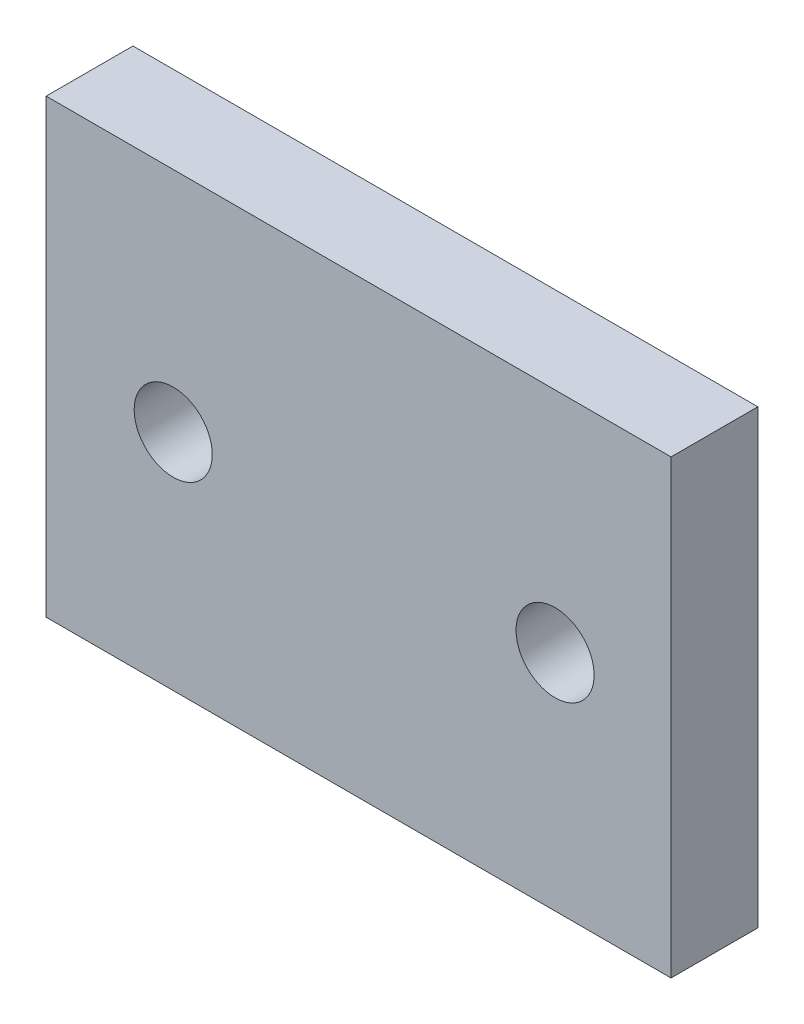
ISO-10303-21;
HEADER;
FILE_DESCRIPTION(('STEP AP214'),'2;1');
FILE_NAME('part.step','',(''),(''),'','','');
FILE_SCHEMA(('AUTOMOTIVE_DESIGN { 1 0 10303 214 1 1 1 1 }'));
ENDSEC;
DATA;
#1=APPLICATION_CONTEXT('core data for automotive mechanical design processes');
#2=APPLICATION_PROTOCOL_DEFINITION('international standard','automotive_design',2000,#1);
#3=PRODUCT_CONTEXT('',#1,'mechanical');
#4=PRODUCT('Part','Part','',(#3));
#5=PRODUCT_RELATED_PRODUCT_CATEGORY('part','',(#4));
#6=PRODUCT_DEFINITION_FORMATION('','',#4);
#7=PRODUCT_DEFINITION_CONTEXT('part definition',#1,'design');
#8=PRODUCT_DEFINITION('design','',#6,#7);
#9=PRODUCT_DEFINITION_SHAPE('','',#8);
#10=(LENGTH_UNIT() NAMED_UNIT(*) SI_UNIT(.MILLI.,.METRE.));
#11=(NAMED_UNIT(*) PLANE_ANGLE_UNIT() SI_UNIT($,.RADIAN.));
#12=(NAMED_UNIT(*) SI_UNIT($,.STERADIAN.) SOLID_ANGLE_UNIT());
#13=UNCERTAINTY_MEASURE_WITH_UNIT(LENGTH_MEASURE(1.E-05),#10,'distance_accuracy_value','');
#14=(GEOMETRIC_REPRESENTATION_CONTEXT(3) GLOBAL_UNCERTAINTY_ASSIGNED_CONTEXT((#13)) GLOBAL_UNIT_ASSIGNED_CONTEXT((#10,
#11,#12)) REPRESENTATION_CONTEXT('',''));
#15=CARTESIAN_POINT('',(0.,0.,0.));
#16=DIRECTION('',(0.,0.,1.));
#17=DIRECTION('',(1.,0.,0.));
#18=AXIS2_PLACEMENT_3D('',#15,#16,#17);
#19=CARTESIAN_POINT('',(18.,-13.,5.));
#20=DIRECTION('',(-1.,0.,0.));
#21=DIRECTION('',(0.,0.,1.));
#22=AXIS2_PLACEMENT_3D('',#19,#20,#21);
#23=PLANE('',#22);
#24=DIRECTION('',(0.,1.,0.));
#25=VECTOR('',#24,1.);
#26=CARTESIAN_POINT('',(18.,-13.,0.));
#27=LINE('',#26,#25);
#28=CARTESIAN_POINT('',(18.,-13.,0.));
#29=VERTEX_POINT('',#28);
#30=CARTESIAN_POINT('',(18.,13.,0.));
#31=VERTEX_POINT('',#30);
#32=EDGE_CURVE('E96',#29,#31,#27,.T.);
#33=ORIENTED_EDGE('',*,*,#32,.T.);
#34=DIRECTION('',(0.,0.,-1.));
#35=VECTOR('',#34,1.);
#36=CARTESIAN_POINT('',(18.,13.,5.));
#37=LINE('',#36,#35);
#38=CARTESIAN_POINT('',(18.,13.,5.));
#39=VERTEX_POINT('',#38);
#40=EDGE_CURVE('E11',#39,#31,#37,.T.);
#41=ORIENTED_EDGE('',*,*,#40,.F.);
#42=DIRECTION('',(0.,1.,0.));
#43=VECTOR('',#42,1.);
#44=CARTESIAN_POINT('',(18.,-13.,5.));
#45=LINE('',#44,#43);
#46=CARTESIAN_POINT('',(18.,-13.,5.));
#47=VERTEX_POINT('',#46);
#48=EDGE_CURVE('E84',#47,#39,#45,.T.);
#49=ORIENTED_EDGE('',*,*,#48,.F.);
#50=DIRECTION('',(0.,0.,-1.));
#51=VECTOR('',#50,1.);
#52=CARTESIAN_POINT('',(18.,-13.,5.));
#53=LINE('',#52,#51);
#54=EDGE_CURVE('E92',#47,#29,#53,.T.);
#55=ORIENTED_EDGE('',*,*,#54,.T.);
#56=EDGE_LOOP('',(#33,#41,#49,#55));
#57=FACE_BOUND('',#56,.T.);
#58=ADVANCED_FACE('F33',(#57),#23,.F.);
#59=CARTESIAN_POINT('',(-18.,13.,5.));
#60=DIRECTION('',(0.,-1.,0.));
#61=DIRECTION('',(0.,0.,-1.));
#62=AXIS2_PLACEMENT_3D('',#59,#60,#61);
#63=PLANE('',#62);
#64=DIRECTION('',(-1.,0.,0.));
#65=VECTOR('',#64,1.);
#66=CARTESIAN_POINT('',(-18.,13.,0.));
#67=LINE('',#66,#65);
#68=CARTESIAN_POINT('',(-18.,13.,0.));
#69=VERTEX_POINT('',#68);
#70=EDGE_CURVE('E88',#31,#69,#67,.T.);
#71=ORIENTED_EDGE('',*,*,#70,.T.);
#72=DIRECTION('',(0.,0.,-1.));
#73=VECTOR('',#72,1.);
#74=CARTESIAN_POINT('',(-18.,13.,5.));
#75=LINE('',#74,#73);
#76=CARTESIAN_POINT('',(-18.,13.,5.));
#77=VERTEX_POINT('',#76);
#78=EDGE_CURVE('E41',#77,#69,#75,.T.);
#79=ORIENTED_EDGE('',*,*,#78,.F.);
#80=DIRECTION('',(-1.,0.,0.));
#81=VECTOR('',#80,1.);
#82=CARTESIAN_POINT('',(-18.,13.,5.));
#83=LINE('',#82,#81);
#84=EDGE_CURVE('E79',#39,#77,#83,.T.);
#85=ORIENTED_EDGE('',*,*,#84,.F.);
#86=ORIENTED_EDGE('',*,*,#40,.T.);
#87=EDGE_LOOP('',(#71,#79,#85,#86));
#88=FACE_BOUND('',#87,.T.);
#89=ADVANCED_FACE('F87',(#88),#63,.F.);
#90=CARTESIAN_POINT('',(-18.,-13.,5.));
#91=DIRECTION('',(1.,0.,0.));
#92=DIRECTION('',(0.,0.,-1.));
#93=AXIS2_PLACEMENT_3D('',#90,#91,#92);
#94=PLANE('',#93);
#95=DIRECTION('',(0.,-1.,0.));
#96=VECTOR('',#95,1.);
#97=CARTESIAN_POINT('',(-18.,-13.,0.));
#98=LINE('',#97,#96);
#99=CARTESIAN_POINT('',(-18.,-13.,0.));
#100=VERTEX_POINT('',#99);
#101=EDGE_CURVE('E66',#69,#100,#98,.T.);
#102=ORIENTED_EDGE('',*,*,#101,.T.);
#103=DIRECTION('',(0.,0.,-1.));
#104=VECTOR('',#103,1.);
#105=CARTESIAN_POINT('',(-18.,-13.,5.));
#106=LINE('',#105,#104);
#107=CARTESIAN_POINT('',(-18.,-13.,5.));
#108=VERTEX_POINT('',#107);
#109=EDGE_CURVE('E89',#108,#100,#106,.T.);
#110=ORIENTED_EDGE('',*,*,#109,.F.);
#111=DIRECTION('',(0.,-1.,0.));
#112=VECTOR('',#111,1.);
#113=CARTESIAN_POINT('',(-18.,-13.,5.));
#114=LINE('',#113,#112);
#115=EDGE_CURVE('E82',#77,#108,#114,.T.);
#116=ORIENTED_EDGE('',*,*,#115,.F.);
#117=ORIENTED_EDGE('',*,*,#78,.T.);
#118=EDGE_LOOP('',(#102,#110,#116,#117));
#119=FACE_BOUND('',#118,.T.);
#120=ADVANCED_FACE('F90',(#119),#94,.F.);
#121=CARTESIAN_POINT('',(-18.,-13.,5.));
#122=DIRECTION('',(0.,1.,0.));
#123=DIRECTION('',(0.,0.,1.));
#124=AXIS2_PLACEMENT_3D('',#121,#122,#123);
#125=PLANE('',#124);
#126=DIRECTION('',(1.,0.,0.));
#127=VECTOR('',#126,1.);
#128=CARTESIAN_POINT('',(-18.,-13.,0.));
#129=LINE('',#128,#127);
#130=EDGE_CURVE('E72',#100,#29,#129,.T.);
#131=ORIENTED_EDGE('',*,*,#130,.T.);
#132=ORIENTED_EDGE('',*,*,#54,.F.);
#133=DIRECTION('',(1.,0.,0.));
#134=VECTOR('',#133,1.);
#135=CARTESIAN_POINT('',(-18.,-13.,5.));
#136=LINE('',#135,#134);
#137=EDGE_CURVE('E49',#108,#47,#136,.T.);
#138=ORIENTED_EDGE('',*,*,#137,.F.);
#139=ORIENTED_EDGE('',*,*,#109,.T.);
#140=EDGE_LOOP('',(#131,#132,#138,#139));
#141=FACE_BOUND('',#140,.T.);
#142=ADVANCED_FACE('F104',(#141),#125,.F.);
#143=CARTESIAN_POINT('',(0.,0.,5.));
#144=DIRECTION('',(0.,0.,-1.));
#145=DIRECTION('',(-1.,0.,0.));
#146=AXIS2_PLACEMENT_3D('',#143,#144,#145);
#147=PLANE('',#146);
#148=CARTESIAN_POINT('',(11.3188875959707,-0.107841378020033,5.));
#149=DIRECTION('',(0.,0.,-1.));
#150=DIRECTION('',(-1.,0.,0.));
#151=AXIS2_PLACEMENT_3D('',#148,#149,#150);
#152=CIRCLE('',#151,2.25);
#153=CARTESIAN_POINT('',(9.06888759597066,-0.107841378020033,5.));
#154=VERTEX_POINT('',#153);
#155=EDGE_CURVE('E115',#154,#154,#152,.T.);
#156=ORIENTED_EDGE('',*,*,#155,.T.);
#157=EDGE_LOOP('',(#156));
#158=FACE_BOUND('',#157,.T.);
#159=CARTESIAN_POINT('',(-10.681112224082,-0.105027539955879,5.));
#160=DIRECTION('',(0.,0.,-1.));
#161=DIRECTION('',(-1.,0.,0.));
#162=AXIS2_PLACEMENT_3D('',#159,#160,#161);
#163=CIRCLE('',#162,2.25);
#164=CARTESIAN_POINT('',(-12.931112224082,-0.105027539955879,5.));
#165=VERTEX_POINT('',#164);
#166=EDGE_CURVE('E99',#165,#165,#163,.T.);
#167=ORIENTED_EDGE('',*,*,#166,.T.);
#168=EDGE_LOOP('',(#167));
#169=FACE_BOUND('',#168,.T.);
#170=ORIENTED_EDGE('',*,*,#48,.T.);
#171=ORIENTED_EDGE('',*,*,#84,.T.);
#172=ORIENTED_EDGE('',*,*,#115,.T.);
#173=ORIENTED_EDGE('',*,*,#137,.T.);
#174=EDGE_LOOP('',(#170,#171,#172,#173));
#175=FACE_BOUND('',#174,.T.);
#176=ADVANCED_FACE('F80',(#158,#169,#175),#147,.F.);
#177=CARTESIAN_POINT('',(0.,0.,0.));
#178=DIRECTION('',(0.,0.,-1.));
#179=DIRECTION('',(-1.,0.,0.));
#180=AXIS2_PLACEMENT_3D('',#177,#178,#179);
#181=PLANE('',#180);
#182=CARTESIAN_POINT('',(11.3188875959707,-0.107841378020033,0.));
#183=DIRECTION('',(0.,0.,-1.));
#184=DIRECTION('',(-1.,0.,0.));
#185=AXIS2_PLACEMENT_3D('',#182,#183,#184);
#186=CIRCLE('',#185,2.25);
#187=CARTESIAN_POINT('',(9.06888759597066,-0.107841378020033,0.));
#188=VERTEX_POINT('',#187);
#189=EDGE_CURVE('E118',#188,#188,#186,.T.);
#190=ORIENTED_EDGE('',*,*,#189,.F.);
#191=EDGE_LOOP('',(#190));
#192=FACE_BOUND('',#191,.T.);
#193=CARTESIAN_POINT('',(-10.681112224082,-0.105027539955879,0.));
#194=DIRECTION('',(0.,0.,-1.));
#195=DIRECTION('',(-1.,0.,0.));
#196=AXIS2_PLACEMENT_3D('',#193,#194,#195);
#197=CIRCLE('',#196,2.25);
#198=CARTESIAN_POINT('',(-12.931112224082,-0.105027539955879,0.));
#199=VERTEX_POINT('',#198);
#200=EDGE_CURVE('E112',#199,#199,#197,.T.);
#201=ORIENTED_EDGE('',*,*,#200,.F.);
#202=EDGE_LOOP('',(#201));
#203=FACE_BOUND('',#202,.T.);
#204=ORIENTED_EDGE('',*,*,#32,.F.);
#205=ORIENTED_EDGE('',*,*,#130,.F.);
#206=ORIENTED_EDGE('',*,*,#101,.F.);
#207=ORIENTED_EDGE('',*,*,#70,.F.);
#208=EDGE_LOOP('',(#204,#205,#206,#207));
#209=FACE_BOUND('',#208,.T.);
#210=ADVANCED_FACE('F107',(#192,#203,#209),#181,.T.);
#211=CARTESIAN_POINT('',(-10.681112224082,-0.105027539955879,0.));
#212=DIRECTION('',(0.,0.,-1.));
#213=DIRECTION('',(-1.,0.,0.));
#214=AXIS2_PLACEMENT_3D('',#211,#212,#213);
#215=CYLINDRICAL_SURFACE('',#214,2.25);
#216=ORIENTED_EDGE('',*,*,#166,.F.);
#217=EDGE_LOOP('',(#216));
#218=FACE_BOUND('',#217,.T.);
#219=ORIENTED_EDGE('',*,*,#200,.T.);
#220=EDGE_LOOP('',(#219));
#221=FACE_BOUND('',#220,.T.);
#222=ADVANCED_FACE('F126',(#218,#221),#215,.F.);
#223=CARTESIAN_POINT('',(11.3188875959707,-0.107841378020033,0.));
#224=DIRECTION('',(0.,0.,-1.));
#225=DIRECTION('',(-1.,0.,0.));
#226=AXIS2_PLACEMENT_3D('',#223,#224,#225);
#227=CYLINDRICAL_SURFACE('',#226,2.25);
#228=ORIENTED_EDGE('',*,*,#155,.F.);
#229=EDGE_LOOP('',(#228));
#230=FACE_BOUND('',#229,.T.);
#231=ORIENTED_EDGE('',*,*,#189,.T.);
#232=EDGE_LOOP('',(#231));
#233=FACE_BOUND('',#232,.T.);
#234=ADVANCED_FACE('F122',(#230,#233),#227,.F.);
#235=CLOSED_SHELL('',(#58,#89,#120,#142,#176,#210,#222,#234));
#236=MANIFOLD_SOLID_BREP('B2',#235);
#237=ADVANCED_BREP_SHAPE_REPRESENTATION('',(#18,#236),#14);
#238=SHAPE_DEFINITION_REPRESENTATION(#9,#237);
ENDSEC;
END-ISO-10303-21;
